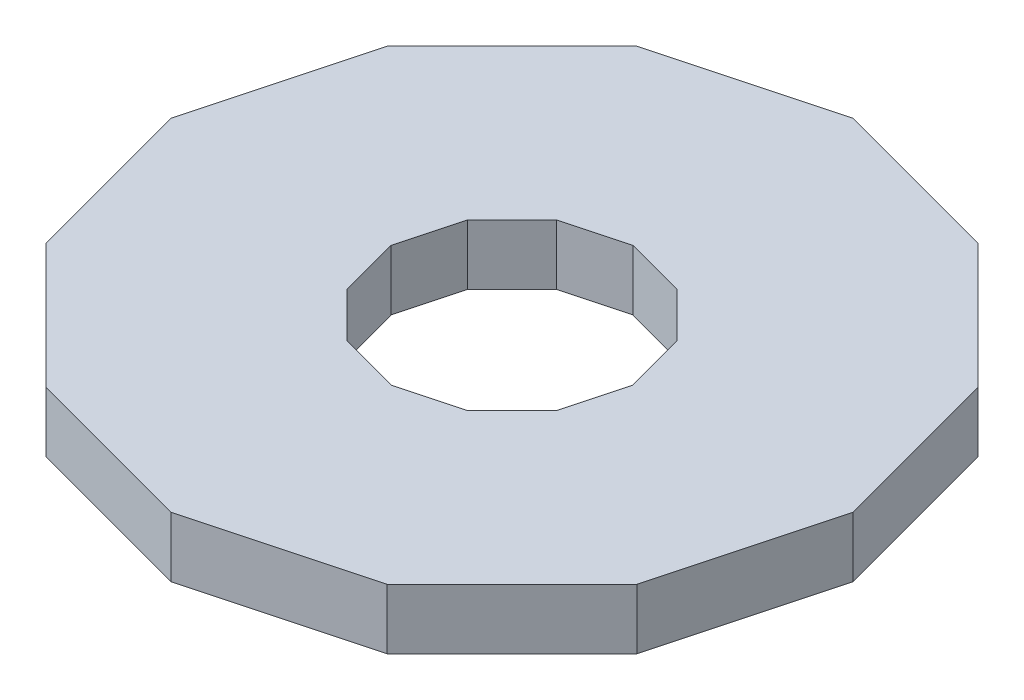
ISO-10303-21;
HEADER;
FILE_DESCRIPTION(('STEP AP214'),'2;1');
FILE_NAME('part.step','',(''),(''),'','','');
FILE_SCHEMA(('AUTOMOTIVE_DESIGN { 1 0 10303 214 1 1 1 1 }'));
ENDSEC;
DATA;
#1=APPLICATION_CONTEXT('core data for automotive mechanical design processes');
#2=APPLICATION_PROTOCOL_DEFINITION('international standard','automotive_design',2000,#1);
#3=PRODUCT_CONTEXT('',#1,'mechanical');
#4=PRODUCT('Part','Part','',(#3));
#5=PRODUCT_RELATED_PRODUCT_CATEGORY('part','',(#4));
#6=PRODUCT_DEFINITION_FORMATION('','',#4);
#7=PRODUCT_DEFINITION_CONTEXT('part definition',#1,'design');
#8=PRODUCT_DEFINITION('design','',#6,#7);
#9=PRODUCT_DEFINITION_SHAPE('','',#8);
#10=(LENGTH_UNIT() NAMED_UNIT(*) SI_UNIT(.MILLI.,.METRE.));
#11=(NAMED_UNIT(*) PLANE_ANGLE_UNIT() SI_UNIT($,.RADIAN.));
#12=(NAMED_UNIT(*) SI_UNIT($,.STERADIAN.) SOLID_ANGLE_UNIT());
#13=UNCERTAINTY_MEASURE_WITH_UNIT(LENGTH_MEASURE(1.E-05),#10,'distance_accuracy_value','');
#14=(GEOMETRIC_REPRESENTATION_CONTEXT(3) GLOBAL_UNCERTAINTY_ASSIGNED_CONTEXT((#13)) GLOBAL_UNIT_ASSIGNED_CONTEXT((#10,
#11,#12)) REPRESENTATION_CONTEXT('',''));
#15=CARTESIAN_POINT('',(0.,0.,0.));
#16=DIRECTION('',(0.,0.,1.));
#17=DIRECTION('',(1.,0.,0.));
#18=AXIS2_PLACEMENT_3D('',#15,#16,#17);
#19=CARTESIAN_POINT('',(0.,19.05,0.));
#20=DIRECTION('',(0.,1.,0.));
#21=DIRECTION('',(0.,0.,1.));
#22=AXIS2_PLACEMENT_3D('',#19,#20,#21);
#23=PLANE('',#22);
#24=DIRECTION('',(-0.258819045102521,0.,0.965925826289068));
#25=VECTOR('',#24,1.);
#26=CARTESIAN_POINT('',(-93.4890621057374,19.05,-53.9759351730331));
#27=LINE('',#26,#25);
#28=CARTESIAN_POINT('',(-93.4890621057374,19.05,-53.9759351730331));
#29=VERTEX_POINT('',#28);
#30=CARTESIAN_POINT('',(-107.951870346066,19.05,0.));
#31=VERTEX_POINT('',#30);
#32=EDGE_CURVE('E291',#29,#31,#27,.T.);
#33=ORIENTED_EDGE('',*,*,#32,.T.);
#34=DIRECTION('',(0.258819045102521,0.,0.965925826289068));
#35=VECTOR('',#34,1.);
#36=CARTESIAN_POINT('',(-107.951870346066,19.05,0.));
#37=LINE('',#36,#35);
#38=CARTESIAN_POINT('',(-93.4890621057374,19.05,53.9759351730331));
#39=VERTEX_POINT('',#38);
#40=EDGE_CURVE('E294',#31,#39,#37,.T.);
#41=ORIENTED_EDGE('',*,*,#40,.T.);
#42=DIRECTION('',(0.707106781186548,0.,0.707106781186547));
#43=VECTOR('',#42,1.);
#44=CARTESIAN_POINT('',(-93.4890621057374,19.05,53.9759351730331));
#45=LINE('',#44,#43);
#46=CARTESIAN_POINT('',(-53.9759351730331,19.05,93.4890621057374));
#47=VERTEX_POINT('',#46);
#48=EDGE_CURVE('E297',#39,#47,#45,.T.);
#49=ORIENTED_EDGE('',*,*,#48,.T.);
#50=DIRECTION('',(0.965925826289069,0.,0.25881904510252));
#51=VECTOR('',#50,1.);
#52=CARTESIAN_POINT('',(-53.9759351730331,19.05,93.4890621057374));
#53=LINE('',#52,#51);
#54=CARTESIAN_POINT('',(0.,19.05,107.951870346066));
#55=VERTEX_POINT('',#54);
#56=EDGE_CURVE('E299',#47,#55,#53,.T.);
#57=ORIENTED_EDGE('',*,*,#56,.T.);
#58=DIRECTION('',(0.965925826289068,0.,-0.258819045102521));
#59=VECTOR('',#58,1.);
#60=CARTESIAN_POINT('',(0.,19.05,107.951870346066));
#61=LINE('',#60,#59);
#62=CARTESIAN_POINT('',(53.9759351730332,19.05,93.4890621057374));
#63=VERTEX_POINT('',#62);
#64=EDGE_CURVE('E301',#55,#63,#61,.T.);
#65=ORIENTED_EDGE('',*,*,#64,.T.);
#66=DIRECTION('',(0.707106781186547,0.,-0.707106781186548));
#67=VECTOR('',#66,1.);
#68=CARTESIAN_POINT('',(53.9759351730332,19.05,93.4890621057374));
#69=LINE('',#68,#67);
#70=CARTESIAN_POINT('',(93.4890621057374,19.05,53.9759351730331));
#71=VERTEX_POINT('',#70);
#72=EDGE_CURVE('E303',#63,#71,#69,.T.);
#73=ORIENTED_EDGE('',*,*,#72,.T.);
#74=DIRECTION('',(0.258819045102521,0.,-0.965925826289068));
#75=VECTOR('',#74,1.);
#76=CARTESIAN_POINT('',(93.4890621057374,19.05,53.9759351730331));
#77=LINE('',#76,#75);
#78=CARTESIAN_POINT('',(107.951870346066,19.05,0.));
#79=VERTEX_POINT('',#78);
#80=EDGE_CURVE('E305',#71,#79,#77,.T.);
#81=ORIENTED_EDGE('',*,*,#80,.T.);
#82=DIRECTION('',(-0.258819045102521,0.,-0.965925826289068));
#83=VECTOR('',#82,1.);
#84=CARTESIAN_POINT('',(107.951870346066,19.05,0.));
#85=LINE('',#84,#83);
#86=CARTESIAN_POINT('',(93.4890621057374,19.05,-53.9759351730332));
#87=VERTEX_POINT('',#86);
#88=EDGE_CURVE('E307',#79,#87,#85,.T.);
#89=ORIENTED_EDGE('',*,*,#88,.T.);
#90=DIRECTION('',(-0.707106781186548,0.,-0.707106781186547));
#91=VECTOR('',#90,1.);
#92=CARTESIAN_POINT('',(93.4890621057374,19.05,-53.9759351730332));
#93=LINE('',#92,#91);
#94=CARTESIAN_POINT('',(53.9759351730331,19.05,-93.4890621057375));
#95=VERTEX_POINT('',#94);
#96=EDGE_CURVE('E309',#87,#95,#93,.T.);
#97=ORIENTED_EDGE('',*,*,#96,.T.);
#98=DIRECTION('',(-0.965925826289068,0.,-0.258819045102521));
#99=VECTOR('',#98,1.);
#100=CARTESIAN_POINT('',(53.9759351730331,19.05,-93.4890621057375));
#101=LINE('',#100,#99);
#102=CARTESIAN_POINT('',(0.,19.05,-107.951870346066));
#103=VERTEX_POINT('',#102);
#104=EDGE_CURVE('E311',#95,#103,#101,.T.);
#105=ORIENTED_EDGE('',*,*,#104,.T.);
#106=DIRECTION('',(-0.965925826289068,0.,0.258819045102521));
#107=VECTOR('',#106,1.);
#108=CARTESIAN_POINT('',(0.,19.05,-107.951870346066));
#109=LINE('',#108,#107);
#110=CARTESIAN_POINT('',(-53.9759351730331,19.05,-93.4890621057374));
#111=VERTEX_POINT('',#110);
#112=EDGE_CURVE('E313',#103,#111,#109,.T.);
#113=ORIENTED_EDGE('',*,*,#112,.T.);
#114=DIRECTION('',(-0.707106781186548,0.,0.707106781186548));
#115=VECTOR('',#114,1.);
#116=CARTESIAN_POINT('',(-53.9759351730331,19.05,-93.4890621057374));
#117=LINE('',#116,#115);
#118=EDGE_CURVE('E315',#111,#29,#117,.T.);
#119=ORIENTED_EDGE('',*,*,#118,.T.);
#120=EDGE_LOOP('',(#33,#41,#49,#57,#65,#73,#81,#89,#97,#105,#113,#119));
#121=FACE_BOUND('',#120,.T.);
#122=DIRECTION('',(0.258819045102521,0.,0.965925826289068));
#123=VECTOR('',#122,1.);
#124=CARTESIAN_POINT('',(-38.2674306426635,19.05,0.));
#125=LINE('',#124,#123);
#126=CARTESIAN_POINT('',(-38.2674306426635,19.05,0.));
#127=VERTEX_POINT('',#126);
#128=CARTESIAN_POINT('',(-33.1405670741057,19.05,19.1337153213318));
#129=VERTEX_POINT('',#128);
#130=EDGE_CURVE('E204',#127,#129,#125,.T.);
#131=ORIENTED_EDGE('',*,*,#130,.F.);
#132=DIRECTION('',(-0.258819045102521,0.,0.965925826289068));
#133=VECTOR('',#132,1.);
#134=CARTESIAN_POINT('',(-33.1405670741057,19.05,-19.1337153213318));
#135=LINE('',#134,#133);
#136=CARTESIAN_POINT('',(-33.1405670741057,19.05,-19.1337153213318));
#137=VERTEX_POINT('',#136);
#138=EDGE_CURVE('E196',#137,#127,#135,.T.);
#139=ORIENTED_EDGE('',*,*,#138,.F.);
#140=DIRECTION('',(-0.707106781186548,0.,0.707106781186547));
#141=VECTOR('',#140,1.);
#142=CARTESIAN_POINT('',(-19.1337153213317,19.05,-33.1405670741057));
#143=LINE('',#142,#141);
#144=CARTESIAN_POINT('',(-19.1337153213317,19.05,-33.1405670741057));
#145=VERTEX_POINT('',#144);
#146=EDGE_CURVE('E238',#145,#137,#143,.T.);
#147=ORIENTED_EDGE('',*,*,#146,.F.);
#148=DIRECTION('',(-0.965925826289068,0.,0.258819045102521));
#149=VECTOR('',#148,1.);
#150=CARTESIAN_POINT('',(0.,19.05,-38.2674306426635));
#151=LINE('',#150,#149);
#152=CARTESIAN_POINT('',(0.,19.05,-38.2674306426635));
#153=VERTEX_POINT('',#152);
#154=EDGE_CURVE('E236',#153,#145,#151,.T.);
#155=ORIENTED_EDGE('',*,*,#154,.F.);
#156=DIRECTION('',(-0.965925826289068,0.,-0.258819045102521));
#157=VECTOR('',#156,1.);
#158=CARTESIAN_POINT('',(19.1337153213318,19.05,-33.1405670741057));
#159=LINE('',#158,#157);
#160=CARTESIAN_POINT('',(19.1337153213318,19.05,-33.1405670741057));
#161=VERTEX_POINT('',#160);
#162=EDGE_CURVE('E234',#161,#153,#159,.T.);
#163=ORIENTED_EDGE('',*,*,#162,.F.);
#164=DIRECTION('',(-0.707106781186547,0.,-0.707106781186548));
#165=VECTOR('',#164,1.);
#166=CARTESIAN_POINT('',(33.1405670741057,19.05,-19.1337153213318));
#167=LINE('',#166,#165);
#168=CARTESIAN_POINT('',(33.1405670741057,19.05,-19.1337153213318));
#169=VERTEX_POINT('',#168);
#170=EDGE_CURVE('E232',#169,#161,#167,.T.);
#171=ORIENTED_EDGE('',*,*,#170,.F.);
#172=DIRECTION('',(-0.258819045102521,0.,-0.965925826289068));
#173=VECTOR('',#172,1.);
#174=CARTESIAN_POINT('',(38.2674306426635,19.05,0.));
#175=LINE('',#174,#173);
#176=CARTESIAN_POINT('',(38.2674306426635,19.05,0.));
#177=VERTEX_POINT('',#176);
#178=EDGE_CURVE('E230',#177,#169,#175,.T.);
#179=ORIENTED_EDGE('',*,*,#178,.F.);
#180=DIRECTION('',(0.258819045102521,0.,-0.965925826289068));
#181=VECTOR('',#180,1.);
#182=CARTESIAN_POINT('',(33.1405670741057,19.05,19.1337153213318));
#183=LINE('',#182,#181);
#184=CARTESIAN_POINT('',(33.1405670741057,19.05,19.1337153213318));
#185=VERTEX_POINT('',#184);
#186=EDGE_CURVE('E228',#185,#177,#183,.T.);
#187=ORIENTED_EDGE('',*,*,#186,.F.);
#188=DIRECTION('',(0.707106781186547,0.,-0.707106781186548));
#189=VECTOR('',#188,1.);
#190=CARTESIAN_POINT('',(19.1337153213318,19.05,33.1405670741057));
#191=LINE('',#190,#189);
#192=CARTESIAN_POINT('',(19.1337153213318,19.05,33.1405670741057));
#193=VERTEX_POINT('',#192);
#194=EDGE_CURVE('E225',#193,#185,#191,.T.);
#195=ORIENTED_EDGE('',*,*,#194,.F.);
#196=DIRECTION('',(0.965925826289068,0.,-0.258819045102521));
#197=VECTOR('',#196,1.);
#198=CARTESIAN_POINT('',(0.,19.05,38.2674306426635));
#199=LINE('',#198,#197);
#200=CARTESIAN_POINT('',(0.,19.05,38.2674306426635));
#201=VERTEX_POINT('',#200);
#202=EDGE_CURVE('E223',#201,#193,#199,.T.);
#203=ORIENTED_EDGE('',*,*,#202,.F.);
#204=DIRECTION('',(0.965925826289068,0.,0.258819045102521));
#205=VECTOR('',#204,1.);
#206=CARTESIAN_POINT('',(-19.1337153213318,19.05,33.1405670741057));
#207=LINE('',#206,#205);
#208=CARTESIAN_POINT('',(-19.1337153213318,19.05,33.1405670741057));
#209=VERTEX_POINT('',#208);
#210=EDGE_CURVE('E219',#209,#201,#207,.T.);
#211=ORIENTED_EDGE('',*,*,#210,.F.);
#212=DIRECTION('',(0.707106781186547,0.,0.707106781186547));
#213=VECTOR('',#212,1.);
#214=CARTESIAN_POINT('',(-33.1405670741057,19.05,19.1337153213318));
#215=LINE('',#214,#213);
#216=EDGE_CURVE('E217',#129,#209,#215,.T.);
#217=ORIENTED_EDGE('',*,*,#216,.F.);
#218=EDGE_LOOP('',(#131,#139,#147,#155,#163,#171,#179,#187,#195,#203,#211,#217));
#219=FACE_BOUND('',#218,.T.);
#220=ADVANCED_FACE('F35',(#121,#219),#23,.T.);
#221=CARTESIAN_POINT('',(0.,0.,0.));
#222=DIRECTION('',(0.,1.,0.));
#223=DIRECTION('',(0.,0.,1.));
#224=AXIS2_PLACEMENT_3D('',#221,#222,#223);
#225=PLANE('',#224);
#226=DIRECTION('',(-0.258819045102521,0.,0.965925826289068));
#227=VECTOR('',#226,1.);
#228=CARTESIAN_POINT('',(-93.4890621057374,0.,-53.9759351730331));
#229=LINE('',#228,#227);
#230=CARTESIAN_POINT('',(-93.4890621057374,0.,-53.9759351730331));
#231=VERTEX_POINT('',#230);
#232=CARTESIAN_POINT('',(-107.951870346066,0.,0.));
#233=VERTEX_POINT('',#232);
#234=EDGE_CURVE('E212',#231,#233,#229,.T.);
#235=ORIENTED_EDGE('',*,*,#234,.F.);
#236=DIRECTION('',(-0.707106781186548,0.,0.707106781186548));
#237=VECTOR('',#236,1.);
#238=CARTESIAN_POINT('',(-53.9759351730331,0.,-93.4890621057374));
#239=LINE('',#238,#237);
#240=CARTESIAN_POINT('',(-53.9759351730331,0.,-93.4890621057374));
#241=VERTEX_POINT('',#240);
#242=EDGE_CURVE('E295',#241,#231,#239,.T.);
#243=ORIENTED_EDGE('',*,*,#242,.F.);
#244=DIRECTION('',(-0.965925826289068,0.,0.258819045102521));
#245=VECTOR('',#244,1.);
#246=CARTESIAN_POINT('',(0.,0.,-107.951870346066));
#247=LINE('',#246,#245);
#248=CARTESIAN_POINT('',(0.,0.,-107.951870346066));
#249=VERTEX_POINT('',#248);
#250=EDGE_CURVE('E338',#249,#241,#247,.T.);
#251=ORIENTED_EDGE('',*,*,#250,.F.);
#252=DIRECTION('',(-0.965925826289068,0.,-0.258819045102521));
#253=VECTOR('',#252,1.);
#254=CARTESIAN_POINT('',(53.9759351730331,0.,-93.4890621057375));
#255=LINE('',#254,#253);
#256=CARTESIAN_POINT('',(53.9759351730331,0.,-93.4890621057375));
#257=VERTEX_POINT('',#256);
#258=EDGE_CURVE('E336',#257,#249,#255,.T.);
#259=ORIENTED_EDGE('',*,*,#258,.F.);
#260=DIRECTION('',(-0.707106781186548,0.,-0.707106781186547));
#261=VECTOR('',#260,1.);
#262=CARTESIAN_POINT('',(93.4890621057374,0.,-53.9759351730332));
#263=LINE('',#262,#261);
#264=CARTESIAN_POINT('',(93.4890621057374,0.,-53.9759351730332));
#265=VERTEX_POINT('',#264);
#266=EDGE_CURVE('E334',#265,#257,#263,.T.);
#267=ORIENTED_EDGE('',*,*,#266,.F.);
#268=DIRECTION('',(-0.258819045102521,0.,-0.965925826289068));
#269=VECTOR('',#268,1.);
#270=CARTESIAN_POINT('',(107.951870346066,0.,0.));
#271=LINE('',#270,#269);
#272=CARTESIAN_POINT('',(107.951870346066,0.,0.));
#273=VERTEX_POINT('',#272);
#274=EDGE_CURVE('E332',#273,#265,#271,.T.);
#275=ORIENTED_EDGE('',*,*,#274,.F.);
#276=DIRECTION('',(0.258819045102521,0.,-0.965925826289068));
#277=VECTOR('',#276,1.);
#278=CARTESIAN_POINT('',(93.4890621057374,0.,53.9759351730331));
#279=LINE('',#278,#277);
#280=CARTESIAN_POINT('',(93.4890621057374,0.,53.9759351730331));
#281=VERTEX_POINT('',#280);
#282=EDGE_CURVE('E330',#281,#273,#279,.T.);
#283=ORIENTED_EDGE('',*,*,#282,.F.);
#284=DIRECTION('',(0.707106781186547,0.,-0.707106781186548));
#285=VECTOR('',#284,1.);
#286=CARTESIAN_POINT('',(53.9759351730332,0.,93.4890621057374));
#287=LINE('',#286,#285);
#288=CARTESIAN_POINT('',(53.9759351730332,0.,93.4890621057374));
#289=VERTEX_POINT('',#288);
#290=EDGE_CURVE('E328',#289,#281,#287,.T.);
#291=ORIENTED_EDGE('',*,*,#290,.F.);
#292=DIRECTION('',(0.965925826289068,0.,-0.258819045102521));
#293=VECTOR('',#292,1.);
#294=CARTESIAN_POINT('',(0.,0.,107.951870346066));
#295=LINE('',#294,#293);
#296=CARTESIAN_POINT('',(0.,0.,107.951870346066));
#297=VERTEX_POINT('',#296);
#298=EDGE_CURVE('E326',#297,#289,#295,.T.);
#299=ORIENTED_EDGE('',*,*,#298,.F.);
#300=DIRECTION('',(0.965925826289069,0.,0.25881904510252));
#301=VECTOR('',#300,1.);
#302=CARTESIAN_POINT('',(-53.9759351730331,0.,93.4890621057374));
#303=LINE('',#302,#301);
#304=CARTESIAN_POINT('',(-53.9759351730331,0.,93.4890621057374));
#305=VERTEX_POINT('',#304);
#306=EDGE_CURVE('E324',#305,#297,#303,.T.);
#307=ORIENTED_EDGE('',*,*,#306,.F.);
#308=DIRECTION('',(0.707106781186548,0.,0.707106781186547));
#309=VECTOR('',#308,1.);
#310=CARTESIAN_POINT('',(-93.4890621057374,0.,53.9759351730331));
#311=LINE('',#310,#309);
#312=CARTESIAN_POINT('',(-93.4890621057374,0.,53.9759351730331));
#313=VERTEX_POINT('',#312);
#314=EDGE_CURVE('E322',#313,#305,#311,.T.);
#315=ORIENTED_EDGE('',*,*,#314,.F.);
#316=DIRECTION('',(0.258819045102521,0.,0.965925826289068));
#317=VECTOR('',#316,1.);
#318=CARTESIAN_POINT('',(-107.951870346066,0.,0.));
#319=LINE('',#318,#317);
#320=EDGE_CURVE('E320',#233,#313,#319,.T.);
#321=ORIENTED_EDGE('',*,*,#320,.F.);
#322=EDGE_LOOP('',(#235,#243,#251,#259,#267,#275,#283,#291,#299,#307,#315,#321));
#323=FACE_BOUND('',#322,.T.);
#324=DIRECTION('',(-0.258819045102521,0.,0.965925826289068));
#325=VECTOR('',#324,1.);
#326=CARTESIAN_POINT('',(-33.1405670741057,0.,-19.1337153213318));
#327=LINE('',#326,#325);
#328=CARTESIAN_POINT('',(-33.1405670741057,0.,-19.1337153213318));
#329=VERTEX_POINT('',#328);
#330=CARTESIAN_POINT('',(-38.2674306426635,0.,0.));
#331=VERTEX_POINT('',#330);
#332=EDGE_CURVE('E58',#329,#331,#327,.T.);
#333=ORIENTED_EDGE('',*,*,#332,.T.);
#334=DIRECTION('',(0.258819045102521,0.,0.965925826289068));
#335=VECTOR('',#334,1.);
#336=CARTESIAN_POINT('',(-38.2674306426635,0.,0.));
#337=LINE('',#336,#335);
#338=CARTESIAN_POINT('',(-33.1405670741057,0.,19.1337153213318));
#339=VERTEX_POINT('',#338);
#340=EDGE_CURVE('E211',#331,#339,#337,.T.);
#341=ORIENTED_EDGE('',*,*,#340,.T.);
#342=DIRECTION('',(0.707106781186547,0.,0.707106781186547));
#343=VECTOR('',#342,1.);
#344=CARTESIAN_POINT('',(-33.1405670741057,0.,19.1337153213318));
#345=LINE('',#344,#343);
#346=CARTESIAN_POINT('',(-19.1337153213318,0.,33.1405670741057));
#347=VERTEX_POINT('',#346);
#348=EDGE_CURVE('E242',#339,#347,#345,.T.);
#349=ORIENTED_EDGE('',*,*,#348,.T.);
#350=DIRECTION('',(0.965925826289068,0.,0.258819045102521));
#351=VECTOR('',#350,1.);
#352=CARTESIAN_POINT('',(-19.1337153213318,0.,33.1405670741057));
#353=LINE('',#352,#351);
#354=CARTESIAN_POINT('',(0.,0.,38.2674306426635));
#355=VERTEX_POINT('',#354);
#356=EDGE_CURVE('E245',#347,#355,#353,.T.);
#357=ORIENTED_EDGE('',*,*,#356,.T.);
#358=DIRECTION('',(0.965925826289068,0.,-0.258819045102521));
#359=VECTOR('',#358,1.);
#360=CARTESIAN_POINT('',(0.,0.,38.2674306426635));
#361=LINE('',#360,#359);
#362=CARTESIAN_POINT('',(19.1337153213318,0.,33.1405670741057));
#363=VERTEX_POINT('',#362);
#364=EDGE_CURVE('E248',#355,#363,#361,.T.);
#365=ORIENTED_EDGE('',*,*,#364,.T.);
#366=DIRECTION('',(0.707106781186547,0.,-0.707106781186548));
#367=VECTOR('',#366,1.);
#368=CARTESIAN_POINT('',(19.1337153213318,0.,33.1405670741057));
#369=LINE('',#368,#367);
#370=CARTESIAN_POINT('',(33.1405670741057,0.,19.1337153213318));
#371=VERTEX_POINT('',#370);
#372=EDGE_CURVE('E251',#363,#371,#369,.T.);
#373=ORIENTED_EDGE('',*,*,#372,.T.);
#374=DIRECTION('',(0.258819045102521,0.,-0.965925826289068));
#375=VECTOR('',#374,1.);
#376=CARTESIAN_POINT('',(33.1405670741057,0.,19.1337153213318));
#377=LINE('',#376,#375);
#378=CARTESIAN_POINT('',(38.2674306426635,0.,0.));
#379=VERTEX_POINT('',#378);
#380=EDGE_CURVE('E255',#371,#379,#377,.T.);
#381=ORIENTED_EDGE('',*,*,#380,.T.);
#382=DIRECTION('',(-0.258819045102521,0.,-0.965925826289068));
#383=VECTOR('',#382,1.);
#384=CARTESIAN_POINT('',(38.2674306426635,0.,0.));
#385=LINE('',#384,#383);
#386=CARTESIAN_POINT('',(33.1405670741057,0.,-19.1337153213318));
#387=VERTEX_POINT('',#386);
#388=EDGE_CURVE('E258',#379,#387,#385,.T.);
#389=ORIENTED_EDGE('',*,*,#388,.T.);
#390=DIRECTION('',(-0.707106781186547,0.,-0.707106781186548));
#391=VECTOR('',#390,1.);
#392=CARTESIAN_POINT('',(33.1405670741057,0.,-19.1337153213318));
#393=LINE('',#392,#391);
#394=CARTESIAN_POINT('',(19.1337153213318,0.,-33.1405670741057));
#395=VERTEX_POINT('',#394);
#396=EDGE_CURVE('E261',#387,#395,#393,.T.);
#397=ORIENTED_EDGE('',*,*,#396,.T.);
#398=DIRECTION('',(-0.965925826289068,0.,-0.258819045102521));
#399=VECTOR('',#398,1.);
#400=CARTESIAN_POINT('',(19.1337153213318,0.,-33.1405670741057));
#401=LINE('',#400,#399);
#402=CARTESIAN_POINT('',(0.,0.,-38.2674306426635));
#403=VERTEX_POINT('',#402);
#404=EDGE_CURVE('E264',#395,#403,#401,.T.);
#405=ORIENTED_EDGE('',*,*,#404,.T.);
#406=DIRECTION('',(-0.965925826289068,0.,0.258819045102521));
#407=VECTOR('',#406,1.);
#408=CARTESIAN_POINT('',(0.,0.,-38.2674306426635));
#409=LINE('',#408,#407);
#410=CARTESIAN_POINT('',(-19.1337153213317,0.,-33.1405670741057));
#411=VERTEX_POINT('',#410);
#412=EDGE_CURVE('E267',#403,#411,#409,.T.);
#413=ORIENTED_EDGE('',*,*,#412,.T.);
#414=DIRECTION('',(-0.707106781186548,0.,0.707106781186547));
#415=VECTOR('',#414,1.);
#416=CARTESIAN_POINT('',(-19.1337153213317,0.,-33.1405670741057));
#417=LINE('',#416,#415);
#418=EDGE_CURVE('E205',#411,#329,#417,.T.);
#419=ORIENTED_EDGE('',*,*,#418,.T.);
#420=EDGE_LOOP('',(#333,#341,#349,#357,#365,#373,#381,#389,#397,#405,#413,#419));
#421=FACE_BOUND('',#420,.T.);
#422=ADVANCED_FACE('F380',(#323,#421),#225,.F.);
#423=CARTESIAN_POINT('',(-93.4890621057374,19.05,-53.9759351730331));
#424=DIRECTION('',(0.965925826289068,0.,0.258819045102521));
#425=DIRECTION('',(0.258819045102521,0.,-0.965925826289068));
#426=AXIS2_PLACEMENT_3D('',#423,#424,#425);
#427=PLANE('',#426);
#428=ORIENTED_EDGE('',*,*,#234,.T.);
#429=DIRECTION('',(0.,-1.,0.));
#430=VECTOR('',#429,1.);
#431=CARTESIAN_POINT('',(-107.951870346066,19.05,0.));
#432=LINE('',#431,#430);
#433=EDGE_CURVE('E11',#31,#233,#432,.T.);
#434=ORIENTED_EDGE('',*,*,#433,.F.);
#435=ORIENTED_EDGE('',*,*,#32,.F.);
#436=DIRECTION('',(0.,-1.,0.));
#437=VECTOR('',#436,1.);
#438=CARTESIAN_POINT('',(-93.4890621057374,19.05,-53.9759351730331));
#439=LINE('',#438,#437);
#440=EDGE_CURVE('E317',#29,#231,#439,.T.);
#441=ORIENTED_EDGE('',*,*,#440,.T.);
#442=EDGE_LOOP('',(#428,#434,#435,#441));
#443=FACE_BOUND('',#442,.T.);
#444=ADVANCED_FACE('F37',(#443),#427,.F.);
#445=CARTESIAN_POINT('',(-107.951870346066,19.05,0.));
#446=DIRECTION('',(0.965925826289068,0.,-0.258819045102521));
#447=DIRECTION('',(-0.258819045102521,0.,-0.965925826289068));
#448=AXIS2_PLACEMENT_3D('',#445,#446,#447);
#449=PLANE('',#448);
#450=ORIENTED_EDGE('',*,*,#320,.T.);
#451=DIRECTION('',(0.,-1.,0.));
#452=VECTOR('',#451,1.);
#453=CARTESIAN_POINT('',(-93.4890621057374,19.05,53.9759351730331));
#454=LINE('',#453,#452);
#455=EDGE_CURVE('E43',#39,#313,#454,.T.);
#456=ORIENTED_EDGE('',*,*,#455,.F.);
#457=ORIENTED_EDGE('',*,*,#40,.F.);
#458=ORIENTED_EDGE('',*,*,#433,.T.);
#459=EDGE_LOOP('',(#450,#456,#457,#458));
#460=FACE_BOUND('',#459,.T.);
#461=ADVANCED_FACE('F397',(#460),#449,.F.);
#462=CARTESIAN_POINT('',(-93.4890621057374,19.05,53.9759351730331));
#463=DIRECTION('',(0.707106781186547,0.,-0.707106781186548));
#464=DIRECTION('',(-0.707106781186548,0.,-0.707106781186547));
#465=AXIS2_PLACEMENT_3D('',#462,#463,#464);
#466=PLANE('',#465);
#467=ORIENTED_EDGE('',*,*,#314,.T.);
#468=DIRECTION('',(0.,-1.,0.));
#469=VECTOR('',#468,1.);
#470=CARTESIAN_POINT('',(-53.9759351730331,19.05,93.4890621057374));
#471=LINE('',#470,#469);
#472=EDGE_CURVE('E367',#47,#305,#471,.T.);
#473=ORIENTED_EDGE('',*,*,#472,.F.);
#474=ORIENTED_EDGE('',*,*,#48,.F.);
#475=ORIENTED_EDGE('',*,*,#455,.T.);
#476=EDGE_LOOP('',(#467,#473,#474,#475));
#477=FACE_BOUND('',#476,.T.);
#478=ADVANCED_FACE('F374',(#477),#466,.F.);
#479=CARTESIAN_POINT('',(-53.9759351730331,19.05,93.4890621057374));
#480=DIRECTION('',(0.25881904510252,0.,-0.965925826289068));
#481=DIRECTION('',(-0.965925826289068,0.,-0.25881904510252));
#482=AXIS2_PLACEMENT_3D('',#479,#480,#481);
#483=PLANE('',#482);
#484=ORIENTED_EDGE('',*,*,#306,.T.);
#485=DIRECTION('',(0.,-1.,0.));
#486=VECTOR('',#485,1.);
#487=CARTESIAN_POINT('',(0.,19.05,107.951870346066));
#488=LINE('',#487,#486);
#489=EDGE_CURVE('E364',#55,#297,#488,.T.);
#490=ORIENTED_EDGE('',*,*,#489,.F.);
#491=ORIENTED_EDGE('',*,*,#56,.F.);
#492=ORIENTED_EDGE('',*,*,#472,.T.);
#493=EDGE_LOOP('',(#484,#490,#491,#492));
#494=FACE_BOUND('',#493,.T.);
#495=ADVANCED_FACE('F386',(#494),#483,.F.);
#496=CARTESIAN_POINT('',(0.,19.05,107.951870346066));
#497=DIRECTION('',(-0.258819045102521,0.,-0.965925826289068));
#498=DIRECTION('',(-0.965925826289068,0.,0.258819045102521));
#499=AXIS2_PLACEMENT_3D('',#496,#497,#498);
#500=PLANE('',#499);
#501=ORIENTED_EDGE('',*,*,#298,.T.);
#502=DIRECTION('',(0.,-1.,0.));
#503=VECTOR('',#502,1.);
#504=CARTESIAN_POINT('',(53.9759351730332,19.05,93.4890621057374));
#505=LINE('',#504,#503);
#506=EDGE_CURVE('E361',#63,#289,#505,.T.);
#507=ORIENTED_EDGE('',*,*,#506,.F.);
#508=ORIENTED_EDGE('',*,*,#64,.F.);
#509=ORIENTED_EDGE('',*,*,#489,.T.);
#510=EDGE_LOOP('',(#501,#507,#508,#509));
#511=FACE_BOUND('',#510,.T.);
#512=ADVANCED_FACE('F390',(#511),#500,.F.);
#513=CARTESIAN_POINT('',(53.9759351730332,19.05,93.4890621057374));
#514=DIRECTION('',(-0.707106781186548,0.,-0.707106781186547));
#515=DIRECTION('',(-0.707106781186547,0.,0.707106781186548));
#516=AXIS2_PLACEMENT_3D('',#513,#514,#515);
#517=PLANE('',#516);
#518=ORIENTED_EDGE('',*,*,#290,.T.);
#519=DIRECTION('',(0.,-1.,0.));
#520=VECTOR('',#519,1.);
#521=CARTESIAN_POINT('',(93.4890621057374,19.05,53.9759351730331));
#522=LINE('',#521,#520);
#523=EDGE_CURVE('E358',#71,#281,#522,.T.);
#524=ORIENTED_EDGE('',*,*,#523,.F.);
#525=ORIENTED_EDGE('',*,*,#72,.F.);
#526=ORIENTED_EDGE('',*,*,#506,.T.);
#527=EDGE_LOOP('',(#518,#524,#525,#526));
#528=FACE_BOUND('',#527,.T.);
#529=ADVANCED_FACE('F430',(#528),#517,.F.);
#530=CARTESIAN_POINT('',(93.4890621057374,19.05,53.9759351730331));
#531=DIRECTION('',(-0.965925826289068,0.,-0.258819045102521));
#532=DIRECTION('',(-0.258819045102521,0.,0.965925826289068));
#533=AXIS2_PLACEMENT_3D('',#530,#531,#532);
#534=PLANE('',#533);
#535=ORIENTED_EDGE('',*,*,#282,.T.);
#536=DIRECTION('',(0.,-1.,0.));
#537=VECTOR('',#536,1.);
#538=CARTESIAN_POINT('',(107.951870346066,19.05,0.));
#539=LINE('',#538,#537);
#540=EDGE_CURVE('E355',#79,#273,#539,.T.);
#541=ORIENTED_EDGE('',*,*,#540,.F.);
#542=ORIENTED_EDGE('',*,*,#80,.F.);
#543=ORIENTED_EDGE('',*,*,#523,.T.);
#544=EDGE_LOOP('',(#535,#541,#542,#543));
#545=FACE_BOUND('',#544,.T.);
#546=ADVANCED_FACE('F428',(#545),#534,.F.);
#547=CARTESIAN_POINT('',(107.951870346066,19.05,0.));
#548=DIRECTION('',(-0.965925826289068,0.,0.258819045102521));
#549=DIRECTION('',(0.258819045102521,0.,0.965925826289068));
#550=AXIS2_PLACEMENT_3D('',#547,#548,#549);
#551=PLANE('',#550);
#552=ORIENTED_EDGE('',*,*,#274,.T.);
#553=DIRECTION('',(0.,-1.,0.));
#554=VECTOR('',#553,1.);
#555=CARTESIAN_POINT('',(93.4890621057374,19.05,-53.9759351730332));
#556=LINE('',#555,#554);
#557=EDGE_CURVE('E352',#87,#265,#556,.T.);
#558=ORIENTED_EDGE('',*,*,#557,.F.);
#559=ORIENTED_EDGE('',*,*,#88,.F.);
#560=ORIENTED_EDGE('',*,*,#540,.T.);
#561=EDGE_LOOP('',(#552,#558,#559,#560));
#562=FACE_BOUND('',#561,.T.);
#563=ADVANCED_FACE('F424',(#562),#551,.F.);
#564=CARTESIAN_POINT('',(93.4890621057374,19.05,-53.9759351730332));
#565=DIRECTION('',(-0.707106781186547,0.,0.707106781186548));
#566=DIRECTION('',(0.707106781186548,0.,0.707106781186547));
#567=AXIS2_PLACEMENT_3D('',#564,#565,#566);
#568=PLANE('',#567);
#569=ORIENTED_EDGE('',*,*,#266,.T.);
#570=DIRECTION('',(0.,-1.,0.));
#571=VECTOR('',#570,1.);
#572=CARTESIAN_POINT('',(53.9759351730331,19.05,-93.4890621057375));
#573=LINE('',#572,#571);
#574=EDGE_CURVE('E349',#95,#257,#573,.T.);
#575=ORIENTED_EDGE('',*,*,#574,.F.);
#576=ORIENTED_EDGE('',*,*,#96,.F.);
#577=ORIENTED_EDGE('',*,*,#557,.T.);
#578=EDGE_LOOP('',(#569,#575,#576,#577));
#579=FACE_BOUND('',#578,.T.);
#580=ADVANCED_FACE('F419',(#579),#568,.F.);
#581=CARTESIAN_POINT('',(53.9759351730331,19.05,-93.4890621057375));
#582=DIRECTION('',(-0.258819045102521,0.,0.965925826289068));
#583=DIRECTION('',(0.965925826289068,0.,0.258819045102521));
#584=AXIS2_PLACEMENT_3D('',#581,#582,#583);
#585=PLANE('',#584);
#586=ORIENTED_EDGE('',*,*,#258,.T.);
#587=DIRECTION('',(0.,-1.,0.));
#588=VECTOR('',#587,1.);
#589=CARTESIAN_POINT('',(0.,19.05,-107.951870346066));
#590=LINE('',#589,#588);
#591=EDGE_CURVE('E346',#103,#249,#590,.T.);
#592=ORIENTED_EDGE('',*,*,#591,.F.);
#593=ORIENTED_EDGE('',*,*,#104,.F.);
#594=ORIENTED_EDGE('',*,*,#574,.T.);
#595=EDGE_LOOP('',(#586,#592,#593,#594));
#596=FACE_BOUND('',#595,.T.);
#597=ADVANCED_FACE('F413',(#596),#585,.F.);
#598=CARTESIAN_POINT('',(0.,19.05,-107.951870346066));
#599=DIRECTION('',(0.258819045102521,0.,0.965925826289068));
#600=DIRECTION('',(0.965925826289068,0.,-0.258819045102521));
#601=AXIS2_PLACEMENT_3D('',#598,#599,#600);
#602=PLANE('',#601);
#603=ORIENTED_EDGE('',*,*,#250,.T.);
#604=DIRECTION('',(0.,-1.,0.));
#605=VECTOR('',#604,1.);
#606=CARTESIAN_POINT('',(-53.9759351730331,19.05,-93.4890621057374));
#607=LINE('',#606,#605);
#608=EDGE_CURVE('E343',#111,#241,#607,.T.);
#609=ORIENTED_EDGE('',*,*,#608,.F.);
#610=ORIENTED_EDGE('',*,*,#112,.F.);
#611=ORIENTED_EDGE('',*,*,#591,.T.);
#612=EDGE_LOOP('',(#603,#609,#610,#611));
#613=FACE_BOUND('',#612,.T.);
#614=ADVANCED_FACE('F409',(#613),#602,.F.);
#615=CARTESIAN_POINT('',(-53.9759351730331,19.05,-93.4890621057374));
#616=DIRECTION('',(0.707106781186548,0.,0.707106781186547));
#617=DIRECTION('',(0.707106781186547,0.,-0.707106781186548));
#618=AXIS2_PLACEMENT_3D('',#615,#616,#617);
#619=PLANE('',#618);
#620=ORIENTED_EDGE('',*,*,#242,.T.);
#621=ORIENTED_EDGE('',*,*,#440,.F.);
#622=ORIENTED_EDGE('',*,*,#118,.F.);
#623=ORIENTED_EDGE('',*,*,#608,.T.);
#624=EDGE_LOOP('',(#620,#621,#622,#623));
#625=FACE_BOUND('',#624,.T.);
#626=ADVANCED_FACE('F404',(#625),#619,.F.);
#627=CARTESIAN_POINT('',(-33.1405670741057,19.05,-19.1337153213318));
#628=DIRECTION('',(0.965925826289068,0.,0.258819045102521));
#629=DIRECTION('',(0.258819045102521,0.,-0.965925826289068));
#630=AXIS2_PLACEMENT_3D('',#627,#628,#629);
#631=PLANE('',#630);
#632=ORIENTED_EDGE('',*,*,#332,.F.);
#633=DIRECTION('',(0.,-1.,0.));
#634=VECTOR('',#633,1.);
#635=CARTESIAN_POINT('',(-33.1405670741057,19.05,-19.1337153213318));
#636=LINE('',#635,#634);
#637=EDGE_CURVE('E200',#137,#329,#636,.T.);
#638=ORIENTED_EDGE('',*,*,#637,.F.);
#639=ORIENTED_EDGE('',*,*,#138,.T.);
#640=DIRECTION('',(0.,-1.,0.));
#641=VECTOR('',#640,1.);
#642=CARTESIAN_POINT('',(-38.2674306426635,19.05,0.));
#643=LINE('',#642,#641);
#644=EDGE_CURVE('E199',#127,#331,#643,.T.);
#645=ORIENTED_EDGE('',*,*,#644,.T.);
#646=EDGE_LOOP('',(#632,#638,#639,#645));
#647=FACE_BOUND('',#646,.T.);
#648=ADVANCED_FACE('F198',(#647),#631,.T.);
#649=CARTESIAN_POINT('',(-38.2674306426635,19.05,0.));
#650=DIRECTION('',(0.965925826289068,0.,-0.258819045102521));
#651=DIRECTION('',(-0.258819045102521,0.,-0.965925826289068));
#652=AXIS2_PLACEMENT_3D('',#649,#650,#651);
#653=PLANE('',#652);
#654=ORIENTED_EDGE('',*,*,#340,.F.);
#655=ORIENTED_EDGE('',*,*,#644,.F.);
#656=ORIENTED_EDGE('',*,*,#130,.T.);
#657=DIRECTION('',(0.,-1.,0.));
#658=VECTOR('',#657,1.);
#659=CARTESIAN_POINT('',(-33.1405670741057,19.05,19.1337153213318));
#660=LINE('',#659,#658);
#661=EDGE_CURVE('E213',#129,#339,#660,.T.);
#662=ORIENTED_EDGE('',*,*,#661,.T.);
#663=EDGE_LOOP('',(#654,#655,#656,#662));
#664=FACE_BOUND('',#663,.T.);
#665=ADVANCED_FACE('F208',(#664),#653,.T.);
#666=CARTESIAN_POINT('',(-33.1405670741057,19.05,19.1337153213318));
#667=DIRECTION('',(0.707106781186547,0.,-0.707106781186547));
#668=DIRECTION('',(-0.707106781186548,0.,-0.707106781186548));
#669=AXIS2_PLACEMENT_3D('',#666,#667,#668);
#670=PLANE('',#669);
#671=ORIENTED_EDGE('',*,*,#348,.F.);
#672=ORIENTED_EDGE('',*,*,#661,.F.);
#673=ORIENTED_EDGE('',*,*,#216,.T.);
#674=DIRECTION('',(0.,-1.,0.));
#675=VECTOR('',#674,1.);
#676=CARTESIAN_POINT('',(-19.1337153213318,19.05,33.1405670741057));
#677=LINE('',#676,#675);
#678=EDGE_CURVE('E288',#209,#347,#677,.T.);
#679=ORIENTED_EDGE('',*,*,#678,.T.);
#680=EDGE_LOOP('',(#671,#672,#673,#679));
#681=FACE_BOUND('',#680,.T.);
#682=ADVANCED_FACE('F488',(#681),#670,.T.);
#683=CARTESIAN_POINT('',(-19.1337153213318,19.05,33.1405670741057));
#684=DIRECTION('',(0.258819045102521,0.,-0.965925826289068));
#685=DIRECTION('',(-0.965925826289068,0.,-0.258819045102521));
#686=AXIS2_PLACEMENT_3D('',#683,#684,#685);
#687=PLANE('',#686);
#688=ORIENTED_EDGE('',*,*,#356,.F.);
#689=ORIENTED_EDGE('',*,*,#678,.F.);
#690=ORIENTED_EDGE('',*,*,#210,.T.);
#691=DIRECTION('',(0.,-1.,0.));
#692=VECTOR('',#691,1.);
#693=CARTESIAN_POINT('',(0.,19.05,38.2674306426635));
#694=LINE('',#693,#692);
#695=EDGE_CURVE('E286',#201,#355,#694,.T.);
#696=ORIENTED_EDGE('',*,*,#695,.T.);
#697=EDGE_LOOP('',(#688,#689,#690,#696));
#698=FACE_BOUND('',#697,.T.);
#699=ADVANCED_FACE('F494',(#698),#687,.T.);
#700=CARTESIAN_POINT('',(0.,19.05,38.2674306426635));
#701=DIRECTION('',(-0.258819045102521,0.,-0.965925826289068));
#702=DIRECTION('',(-0.965925826289068,0.,0.258819045102521));
#703=AXIS2_PLACEMENT_3D('',#700,#701,#702);
#704=PLANE('',#703);
#705=ORIENTED_EDGE('',*,*,#364,.F.);
#706=ORIENTED_EDGE('',*,*,#695,.F.);
#707=ORIENTED_EDGE('',*,*,#202,.T.);
#708=DIRECTION('',(0.,-1.,0.));
#709=VECTOR('',#708,1.);
#710=CARTESIAN_POINT('',(19.1337153213318,19.05,33.1405670741057));
#711=LINE('',#710,#709);
#712=EDGE_CURVE('E284',#193,#363,#711,.T.);
#713=ORIENTED_EDGE('',*,*,#712,.T.);
#714=EDGE_LOOP('',(#705,#706,#707,#713));
#715=FACE_BOUND('',#714,.T.);
#716=ADVANCED_FACE('F502',(#715),#704,.T.);
#717=CARTESIAN_POINT('',(19.1337153213318,19.05,33.1405670741057));
#718=DIRECTION('',(-0.707106781186548,0.,-0.707106781186547));
#719=DIRECTION('',(-0.707106781186547,0.,0.707106781186548));
#720=AXIS2_PLACEMENT_3D('',#717,#718,#719);
#721=PLANE('',#720);
#722=ORIENTED_EDGE('',*,*,#372,.F.);
#723=ORIENTED_EDGE('',*,*,#712,.F.);
#724=ORIENTED_EDGE('',*,*,#194,.T.);
#725=DIRECTION('',(0.,-1.,0.));
#726=VECTOR('',#725,1.);
#727=CARTESIAN_POINT('',(33.1405670741057,19.05,19.1337153213318));
#728=LINE('',#727,#726);
#729=EDGE_CURVE('E282',#185,#371,#728,.T.);
#730=ORIENTED_EDGE('',*,*,#729,.T.);
#731=EDGE_LOOP('',(#722,#723,#724,#730));
#732=FACE_BOUND('',#731,.T.);
#733=ADVANCED_FACE('F510',(#732),#721,.T.);
#734=CARTESIAN_POINT('',(33.1405670741057,19.05,19.1337153213318));
#735=DIRECTION('',(-0.965925826289068,0.,-0.258819045102521));
#736=DIRECTION('',(-0.258819045102521,0.,0.965925826289068));
#737=AXIS2_PLACEMENT_3D('',#734,#735,#736);
#738=PLANE('',#737);
#739=ORIENTED_EDGE('',*,*,#380,.F.);
#740=ORIENTED_EDGE('',*,*,#729,.F.);
#741=ORIENTED_EDGE('',*,*,#186,.T.);
#742=DIRECTION('',(0.,-1.,0.));
#743=VECTOR('',#742,1.);
#744=CARTESIAN_POINT('',(38.2674306426635,19.05,0.));
#745=LINE('',#744,#743);
#746=EDGE_CURVE('E280',#177,#379,#745,.T.);
#747=ORIENTED_EDGE('',*,*,#746,.T.);
#748=EDGE_LOOP('',(#739,#740,#741,#747));
#749=FACE_BOUND('',#748,.T.);
#750=ADVANCED_FACE('F518',(#749),#738,.T.);
#751=CARTESIAN_POINT('',(38.2674306426635,19.05,0.));
#752=DIRECTION('',(-0.965925826289068,0.,0.258819045102521));
#753=DIRECTION('',(0.258819045102521,0.,0.965925826289068));
#754=AXIS2_PLACEMENT_3D('',#751,#752,#753);
#755=PLANE('',#754);
#756=ORIENTED_EDGE('',*,*,#388,.F.);
#757=ORIENTED_EDGE('',*,*,#746,.F.);
#758=ORIENTED_EDGE('',*,*,#178,.T.);
#759=DIRECTION('',(0.,-1.,0.));
#760=VECTOR('',#759,1.);
#761=CARTESIAN_POINT('',(33.1405670741057,19.05,-19.1337153213318));
#762=LINE('',#761,#760);
#763=EDGE_CURVE('E278',#169,#387,#762,.T.);
#764=ORIENTED_EDGE('',*,*,#763,.T.);
#765=EDGE_LOOP('',(#756,#757,#758,#764));
#766=FACE_BOUND('',#765,.T.);
#767=ADVANCED_FACE('F526',(#766),#755,.T.);
#768=CARTESIAN_POINT('',(33.1405670741057,19.05,-19.1337153213318));
#769=DIRECTION('',(-0.707106781186548,0.,0.707106781186547));
#770=DIRECTION('',(0.707106781186547,0.,0.707106781186548));
#771=AXIS2_PLACEMENT_3D('',#768,#769,#770);
#772=PLANE('',#771);
#773=ORIENTED_EDGE('',*,*,#396,.F.);
#774=ORIENTED_EDGE('',*,*,#763,.F.);
#775=ORIENTED_EDGE('',*,*,#170,.T.);
#776=DIRECTION('',(0.,-1.,0.));
#777=VECTOR('',#776,1.);
#778=CARTESIAN_POINT('',(19.1337153213318,19.05,-33.1405670741057));
#779=LINE('',#778,#777);
#780=EDGE_CURVE('E276',#161,#395,#779,.T.);
#781=ORIENTED_EDGE('',*,*,#780,.T.);
#782=EDGE_LOOP('',(#773,#774,#775,#781));
#783=FACE_BOUND('',#782,.T.);
#784=ADVANCED_FACE('F534',(#783),#772,.T.);
#785=CARTESIAN_POINT('',(19.1337153213318,19.05,-33.1405670741057));
#786=DIRECTION('',(-0.258819045102521,0.,0.965925826289068));
#787=DIRECTION('',(0.965925826289068,0.,0.258819045102521));
#788=AXIS2_PLACEMENT_3D('',#785,#786,#787);
#789=PLANE('',#788);
#790=ORIENTED_EDGE('',*,*,#404,.F.);
#791=ORIENTED_EDGE('',*,*,#780,.F.);
#792=ORIENTED_EDGE('',*,*,#162,.T.);
#793=DIRECTION('',(0.,-1.,0.));
#794=VECTOR('',#793,1.);
#795=CARTESIAN_POINT('',(0.,19.05,-38.2674306426635));
#796=LINE('',#795,#794);
#797=EDGE_CURVE('E274',#153,#403,#796,.T.);
#798=ORIENTED_EDGE('',*,*,#797,.T.);
#799=EDGE_LOOP('',(#790,#791,#792,#798));
#800=FACE_BOUND('',#799,.T.);
#801=ADVANCED_FACE('F542',(#800),#789,.T.);
#802=CARTESIAN_POINT('',(0.,19.05,-38.2674306426635));
#803=DIRECTION('',(0.258819045102521,0.,0.965925826289068));
#804=DIRECTION('',(0.965925826289068,0.,-0.258819045102521));
#805=AXIS2_PLACEMENT_3D('',#802,#803,#804);
#806=PLANE('',#805);
#807=ORIENTED_EDGE('',*,*,#412,.F.);
#808=ORIENTED_EDGE('',*,*,#797,.F.);
#809=ORIENTED_EDGE('',*,*,#154,.T.);
#810=DIRECTION('',(0.,-1.,0.));
#811=VECTOR('',#810,1.);
#812=CARTESIAN_POINT('',(-19.1337153213317,19.05,-33.1405670741057));
#813=LINE('',#812,#811);
#814=EDGE_CURVE('E50',#145,#411,#813,.T.);
#815=ORIENTED_EDGE('',*,*,#814,.T.);
#816=EDGE_LOOP('',(#807,#808,#809,#815));
#817=FACE_BOUND('',#816,.T.);
#818=ADVANCED_FACE('F550',(#817),#806,.T.);
#819=CARTESIAN_POINT('',(-19.1337153213317,19.05,-33.1405670741057));
#820=DIRECTION('',(0.707106781186547,0.,0.707106781186548));
#821=DIRECTION('',(0.707106781186548,0.,-0.707106781186547));
#822=AXIS2_PLACEMENT_3D('',#819,#820,#821);
#823=PLANE('',#822);
#824=ORIENTED_EDGE('',*,*,#418,.F.);
#825=ORIENTED_EDGE('',*,*,#814,.F.);
#826=ORIENTED_EDGE('',*,*,#146,.T.);
#827=ORIENTED_EDGE('',*,*,#637,.T.);
#828=EDGE_LOOP('',(#824,#825,#826,#827));
#829=FACE_BOUND('',#828,.T.);
#830=ADVANCED_FACE('F558',(#829),#823,.T.);
#831=CLOSED_SHELL('',(#220,#422,#444,#461,#478,#495,#512,#529,#546,#563,#580,#597,#614,#626,
#648,#665,#682,#699,#716,#733,#750,#767,#784,#801,#818,#830));
#832=MANIFOLD_SOLID_BREP('B2',#831);
#833=ADVANCED_BREP_SHAPE_REPRESENTATION('',(#18,#832),#14);
#834=SHAPE_DEFINITION_REPRESENTATION(#9,#833);
ENDSEC;
END-ISO-10303-21;
